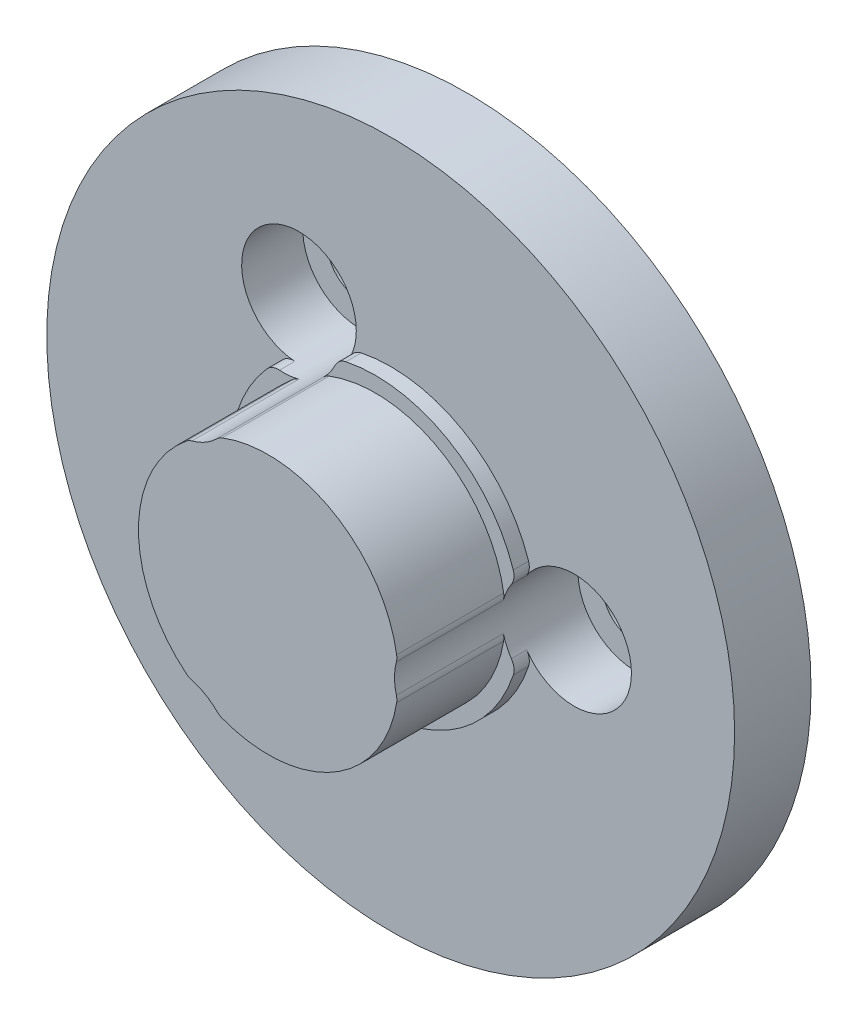
ISO-10303-21;
HEADER;
FILE_DESCRIPTION(('STEP AP214'),'2;1');
FILE_NAME('part.step','',(''),(''),'','','');
FILE_SCHEMA(('AUTOMOTIVE_DESIGN { 1 0 10303 214 1 1 1 1 }'));
ENDSEC;
DATA;
#1=APPLICATION_CONTEXT('core data for automotive mechanical design processes');
#2=APPLICATION_PROTOCOL_DEFINITION('international standard','automotive_design',2000,#1);
#3=PRODUCT_CONTEXT('',#1,'mechanical');
#4=PRODUCT('Part','Part','',(#3));
#5=PRODUCT_RELATED_PRODUCT_CATEGORY('part','',(#4));
#6=PRODUCT_DEFINITION_FORMATION('','',#4);
#7=PRODUCT_DEFINITION_CONTEXT('part definition',#1,'design');
#8=PRODUCT_DEFINITION('design','',#6,#7);
#9=PRODUCT_DEFINITION_SHAPE('','',#8);
#10=(LENGTH_UNIT() NAMED_UNIT(*) SI_UNIT(.MILLI.,.METRE.));
#11=(NAMED_UNIT(*) PLANE_ANGLE_UNIT() SI_UNIT($,.RADIAN.));
#12=(NAMED_UNIT(*) SI_UNIT($,.STERADIAN.) SOLID_ANGLE_UNIT());
#13=UNCERTAINTY_MEASURE_WITH_UNIT(LENGTH_MEASURE(1.E-05),#10,'distance_accuracy_value','');
#14=(GEOMETRIC_REPRESENTATION_CONTEXT(3) GLOBAL_UNCERTAINTY_ASSIGNED_CONTEXT((#13)) GLOBAL_UNIT_ASSIGNED_CONTEXT((#10,
#11,#12)) REPRESENTATION_CONTEXT('',''));
#15=CARTESIAN_POINT('',(0.,0.,0.));
#16=DIRECTION('',(0.,0.,1.));
#17=DIRECTION('',(1.,0.,0.));
#18=AXIS2_PLACEMENT_3D('',#15,#16,#17);
#19=CARTESIAN_POINT('',(0.,0.,37.));
#20=DIRECTION('',(0.,0.,1.));
#21=DIRECTION('',(1.,0.,0.));
#22=AXIS2_PLACEMENT_3D('',#19,#20,#21);
#23=PLANE('',#22);
#24=CARTESIAN_POINT('',(0.,0.,37.));
#25=DIRECTION('',(0.,0.,1.));
#26=DIRECTION('',(1.,0.,0.));
#27=AXIS2_PLACEMENT_3D('',#24,#25,#26);
#28=CIRCLE('',#27,9.5);
#29=CARTESIAN_POINT('',(-1.92716232852517,-9.30247522756785,37.));
#30=VERTEX_POINT('',#29);
#31=CARTESIAN_POINT('',(9.01976102941176,-2.98226608006476,37.));
#32=VERTEX_POINT('',#31);
#33=EDGE_CURVE('E261',#30,#32,#28,.T.);
#34=ORIENTED_EDGE('',*,*,#33,.T.);
#35=CARTESIAN_POINT('',(8.0703125,-2.66834333479479,37.));
#36=DIRECTION('',(0.,0.,1.));
#37=DIRECTION('',(1.,0.,0.));
#38=AXIS2_PLACEMENT_3D('',#35,#36,#37);
#39=CIRCLE('',#38,1.);
#40=CARTESIAN_POINT('',(8.89761513157895,-2.10658684325904,37.));
#41=VERTEX_POINT('',#40);
#42=EDGE_CURVE('E285',#32,#41,#39,.T.);
#43=ORIENTED_EDGE('',*,*,#42,.T.);
#44=CARTESIAN_POINT('',(12.,0.,37.));
#45=DIRECTION('',(0.,0.,1.));
#46=DIRECTION('',(1.,0.,0.));
#47=AXIS2_PLACEMENT_3D('',#44,#45,#46);
#48=CIRCLE('',#47,3.75);
#49=CARTESIAN_POINT('',(8.37129934210425,-0.946061063244322,37.));
#50=VERTEX_POINT('',#49);
#51=EDGE_CURVE('E249',#41,#50,#48,.F.);
#52=ORIENTED_EDGE('',*,*,#51,.T.);
#53=CARTESIAN_POINT('',(7.40364583333205,-1.19834401344281,37.));
#54=DIRECTION('',(0.,0.,1.));
#55=DIRECTION('',(1.,0.,0.));
#56=AXIS2_PLACEMENT_3D('',#53,#54,#55);
#57=CIRCLE('',#56,1.);
#58=CARTESIAN_POINT('',(8.39079861110993,-1.35812321523523,37.));
#59=VERTEX_POINT('',#58);
#60=EDGE_CURVE('E49',#50,#59,#57,.F.);
#61=ORIENTED_EDGE('',*,*,#60,.T.);
#62=CARTESIAN_POINT('',(0.,0.,37.));
#63=DIRECTION('',(0.,0.,1.));
#64=DIRECTION('',(1.,0.,0.));
#65=AXIS2_PLACEMENT_3D('',#62,#63,#64);
#66=CIRCLE('',#65,8.49999999999795);
#67=CARTESIAN_POINT('',(-3.01923009969186,-7.945706362878,37.));
#68=VERTEX_POINT('',#67);
#69=EDGE_CURVE('E362',#68,#59,#66,.T.);
#70=ORIENTED_EDGE('',*,*,#69,.F.);
#71=CARTESIAN_POINT('',(-2.66402655855156,-7.01091737900977,37.));
#72=DIRECTION('',(0.,0.,1.));
#73=DIRECTION('',(1.,0.,0.));
#74=AXIS2_PLACEMENT_3D('',#71,#72,#73);
#75=CIRCLE('',#74,1.);
#76=CARTESIAN_POINT('',(-3.36633675675123,-7.7227884245684,37.));
#77=VERTEX_POINT('',#76);
#78=EDGE_CURVE('E276',#68,#77,#75,.F.);
#79=ORIENTED_EDGE('',*,*,#78,.T.);
#80=CARTESIAN_POINT('',(-6.,-10.3923048454133,37.));
#81=DIRECTION('',(0.,0.,1.));
#82=DIRECTION('',(1.,0.,0.));
#83=AXIS2_PLACEMENT_3D('',#80,#81,#82);
#84=CIRCLE('',#83,3.75);
#85=CARTESIAN_POINT('',(-2.62444984424908,-8.75885415867371,37.));
#86=VERTEX_POINT('',#85);
#87=EDGE_CURVE('E259',#77,#86,#84,.F.);
#88=ORIENTED_EDGE('',*,*,#87,.T.);
#89=CARTESIAN_POINT('',(-1.72430313604883,-8.32326730887649,37.));
#90=DIRECTION('',(0.,0.,1.));
#91=DIRECTION('',(1.,0.,0.));
#92=AXIS2_PLACEMENT_3D('',#89,#90,#91);
#93=CIRCLE('',#92,1.);
#94=EDGE_CURVE('E273',#86,#30,#93,.T.);
#95=ORIENTED_EDGE('',*,*,#94,.T.);
#96=EDGE_LOOP('',(#34,#43,#52,#61,#70,#79,#88,#95));
#97=FACE_BOUND('',#96,.T.);
#98=ADVANCED_FACE('F41',(#97),#23,.T.);
#99=CARTESIAN_POINT('',(-7.0925987008866,6.32020914750309,37.));
#100=VERTEX_POINT('',#99);
#101=CARTESIAN_POINT('',(-7.0925987008866,-6.32020914750309,37.));
#102=VERTEX_POINT('',#101);
#103=EDGE_CURVE('E256',#100,#102,#28,.T.);
#104=ORIENTED_EDGE('',*,*,#103,.T.);
#105=CARTESIAN_POINT('',(-6.34600936395117,-5.65492397408171,37.));
#106=DIRECTION('',(0.,0.,1.));
#107=DIRECTION('',(1.,0.,0.));
#108=AXIS2_PLACEMENT_3D('',#105,#106,#107);
#109=CIRCLE('',#108,1.);
#110=CARTESIAN_POINT('',(-6.27316528732987,-6.65226731541467,37.));
#111=VERTEX_POINT('',#110);
#112=EDGE_CURVE('E308',#102,#111,#109,.T.);
#113=ORIENTED_EDGE('',*,*,#112,.T.);
#114=CARTESIAN_POINT('',(-5.00496258535302,-6.77672736132408,37.));
#115=VERTEX_POINT('',#114);
#116=EDGE_CURVE('E263',#111,#115,#84,.F.);
#117=ORIENTED_EDGE('',*,*,#116,.T.);
#118=CARTESIAN_POINT('',(-4.73961927478049,-5.81257336556697,37.));
#119=DIRECTION('',(0.,0.,1.));
#120=DIRECTION('',(1.,0.,0.));
#121=AXIS2_PLACEMENT_3D('',#118,#119,#120);
#122=CIRCLE('',#121,1.);
#123=CARTESIAN_POINT('',(-5.37156851141806,-6.58758314764278,37.));
#124=VERTEX_POINT('',#123);
#125=EDGE_CURVE('E359',#115,#124,#122,.F.);
#126=ORIENTED_EDGE('',*,*,#125,.T.);
#127=CARTESIAN_POINT('',(-5.37156851141807,6.58758314764277,37.));
#128=VERTEX_POINT('',#127);
#129=EDGE_CURVE('E254',#128,#124,#66,.T.);
#130=ORIENTED_EDGE('',*,*,#129,.F.);
#131=CARTESIAN_POINT('',(-4.7396192747805,5.81257336556696,37.));
#132=DIRECTION('',(0.,0.,1.));
#133=DIRECTION('',(1.,0.,0.));
#134=AXIS2_PLACEMENT_3D('',#131,#132,#133);
#135=CIRCLE('',#134,1.);
#136=CARTESIAN_POINT('',(-5.00496258535303,6.77672736132408,37.));
#137=VERTEX_POINT('',#136);
#138=EDGE_CURVE('E354',#128,#137,#135,.F.);
#139=ORIENTED_EDGE('',*,*,#138,.T.);
#140=CARTESIAN_POINT('',(-6.00000000000001,10.3923048454133,37.));
#141=DIRECTION('',(0.,0.,1.));
#142=DIRECTION('',(1.,0.,0.));
#143=AXIS2_PLACEMENT_3D('',#140,#141,#142);
#144=CIRCLE('',#143,3.75);
#145=CARTESIAN_POINT('',(-6.27316528732987,6.65226731541467,37.));
#146=VERTEX_POINT('',#145);
#147=EDGE_CURVE('E262',#137,#146,#144,.F.);
#148=ORIENTED_EDGE('',*,*,#147,.T.);
#149=CARTESIAN_POINT('',(-6.34600936395117,5.65492397408171,37.));
#150=DIRECTION('',(0.,0.,1.));
#151=DIRECTION('',(1.,0.,0.));
#152=AXIS2_PLACEMENT_3D('',#149,#150,#151);
#153=CIRCLE('',#152,1.);
#154=EDGE_CURVE('E306',#146,#100,#153,.T.);
#155=ORIENTED_EDGE('',*,*,#154,.T.);
#156=EDGE_LOOP('',(#104,#113,#117,#126,#130,#139,#148,#155));
#157=FACE_BOUND('',#156,.T.);
#158=ADVANCED_FACE('F410',(#157),#23,.T.);
#159=CARTESIAN_POINT('',(-6.00000000000001,10.3923048454133,36.));
#160=DIRECTION('',(0.,0.,-1.));
#161=DIRECTION('',(-1.,0.,0.));
#162=AXIS2_PLACEMENT_3D('',#159,#160,#161);
#163=CYLINDRICAL_SURFACE('',#162,2.15);
#164=CARTESIAN_POINT('',(-6.00000000000001,10.3923048454133,31.));
#165=DIRECTION('',(0.,0.,1.));
#166=DIRECTION('',(1.,0.,0.));
#167=AXIS2_PLACEMENT_3D('',#164,#165,#166);
#168=CIRCLE('',#167,2.15);
#169=CARTESIAN_POINT('',(-3.85000000000001,10.3923048454133,31.));
#170=VERTEX_POINT('',#169);
#171=EDGE_CURVE('E569',#170,#170,#168,.T.);
#172=ORIENTED_EDGE('',*,*,#171,.F.);
#173=EDGE_LOOP('',(#172));
#174=FACE_BOUND('',#173,.T.);
#175=CARTESIAN_POINT('',(-6.00000000000001,10.3923048454133,32.));
#176=DIRECTION('',(0.,0.,1.));
#177=DIRECTION('',(1.,0.,0.));
#178=AXIS2_PLACEMENT_3D('',#175,#176,#177);
#179=CIRCLE('',#178,2.15);
#180=CARTESIAN_POINT('',(-3.85000000000001,10.3923048454133,32.));
#181=VERTEX_POINT('',#180);
#182=EDGE_CURVE('E536',#181,#181,#179,.T.);
#183=ORIENTED_EDGE('',*,*,#182,.T.);
#184=EDGE_LOOP('',(#183));
#185=FACE_BOUND('',#184,.T.);
#186=ADVANCED_FACE('F417',(#174,#185),#163,.F.);
#187=CARTESIAN_POINT('',(-6.,-10.3923048454133,36.));
#188=DIRECTION('',(0.,0.,-1.));
#189=DIRECTION('',(-1.,0.,0.));
#190=AXIS2_PLACEMENT_3D('',#187,#188,#189);
#191=CYLINDRICAL_SURFACE('',#190,2.15);
#192=CARTESIAN_POINT('',(-6.,-10.3923048454133,31.));
#193=DIRECTION('',(0.,0.,1.));
#194=DIRECTION('',(1.,0.,0.));
#195=AXIS2_PLACEMENT_3D('',#192,#193,#194);
#196=CIRCLE('',#195,2.15);
#197=CARTESIAN_POINT('',(-3.85,-10.3923048454133,31.));
#198=VERTEX_POINT('',#197);
#199=EDGE_CURVE('E566',#198,#198,#196,.T.);
#200=ORIENTED_EDGE('',*,*,#199,.F.);
#201=EDGE_LOOP('',(#200));
#202=FACE_BOUND('',#201,.T.);
#203=CARTESIAN_POINT('',(-6.,-10.3923048454133,32.));
#204=DIRECTION('',(0.,0.,1.));
#205=DIRECTION('',(1.,0.,0.));
#206=AXIS2_PLACEMENT_3D('',#203,#204,#205);
#207=CIRCLE('',#206,2.15);
#208=CARTESIAN_POINT('',(-3.85,-10.3923048454133,32.));
#209=VERTEX_POINT('',#208);
#210=EDGE_CURVE('E576',#209,#209,#207,.T.);
#211=ORIENTED_EDGE('',*,*,#210,.T.);
#212=EDGE_LOOP('',(#211));
#213=FACE_BOUND('',#212,.T.);
#214=ADVANCED_FACE('F467',(#202,#213),#191,.F.);
#215=CARTESIAN_POINT('',(12.,0.,36.));
#216=DIRECTION('',(0.,0.,-1.));
#217=DIRECTION('',(-1.,0.,0.));
#218=AXIS2_PLACEMENT_3D('',#215,#216,#217);
#219=CYLINDRICAL_SURFACE('',#218,2.15);
#220=CARTESIAN_POINT('',(12.,0.,31.));
#221=DIRECTION('',(0.,0.,1.));
#222=DIRECTION('',(1.,0.,0.));
#223=AXIS2_PLACEMENT_3D('',#220,#221,#222);
#224=CIRCLE('',#223,2.15);
#225=CARTESIAN_POINT('',(14.15,0.,31.));
#226=VERTEX_POINT('',#225);
#227=EDGE_CURVE('E563',#226,#226,#224,.T.);
#228=ORIENTED_EDGE('',*,*,#227,.F.);
#229=EDGE_LOOP('',(#228));
#230=FACE_BOUND('',#229,.T.);
#231=CARTESIAN_POINT('',(12.,0.,32.));
#232=DIRECTION('',(0.,0.,1.));
#233=DIRECTION('',(1.,0.,0.));
#234=AXIS2_PLACEMENT_3D('',#231,#232,#233);
#235=CIRCLE('',#234,2.15);
#236=CARTESIAN_POINT('',(14.15,0.,32.));
#237=VERTEX_POINT('',#236);
#238=EDGE_CURVE('E574',#237,#237,#235,.T.);
#239=ORIENTED_EDGE('',*,*,#238,.T.);
#240=EDGE_LOOP('',(#239));
#241=FACE_BOUND('',#240,.T.);
#242=ADVANCED_FACE('F464',(#230,#241),#219,.F.);
#243=CARTESIAN_POINT('',(0.,0.,36.));
#244=DIRECTION('',(0.,0.,1.));
#245=DIRECTION('',(1.,0.,0.));
#246=AXIS2_PLACEMENT_3D('',#243,#244,#245);
#247=PLANE('',#246);
#248=CARTESIAN_POINT('',(0.,0.,36.));
#249=DIRECTION('',(0.,0.,1.));
#250=DIRECTION('',(1.,0.,0.));
#251=AXIS2_PLACEMENT_3D('',#248,#249,#250);
#252=CIRCLE('',#251,9.5);
#253=CARTESIAN_POINT('',(-1.92716232852517,-9.30247522756785,36.));
#254=VERTEX_POINT('',#253);
#255=CARTESIAN_POINT('',(9.01976102941176,-2.98226608006476,36.));
#256=VERTEX_POINT('',#255);
#257=EDGE_CURVE('E235',#254,#256,#252,.T.);
#258=ORIENTED_EDGE('',*,*,#257,.F.);
#259=CARTESIAN_POINT('',(-1.72430313604883,-8.32326730887649,36.));
#260=DIRECTION('',(0.,0.,1.));
#261=DIRECTION('',(1.,0.,0.));
#262=AXIS2_PLACEMENT_3D('',#259,#260,#261);
#263=CIRCLE('',#262,1.);
#264=CARTESIAN_POINT('',(-2.62444984424908,-8.75885415867371,36.));
#265=VERTEX_POINT('',#264);
#266=EDGE_CURVE('E347',#254,#265,#263,.F.);
#267=ORIENTED_EDGE('',*,*,#266,.T.);
#268=CARTESIAN_POINT('',(-6.,-10.3923048454133,36.));
#269=DIRECTION('',(0.,0.,1.));
#270=DIRECTION('',(1.,0.,0.));
#271=AXIS2_PLACEMENT_3D('',#268,#269,#270);
#272=CIRCLE('',#271,3.75);
#273=CARTESIAN_POINT('',(-6.27316528732987,-6.65226731541467,36.));
#274=VERTEX_POINT('',#273);
#275=EDGE_CURVE('E557',#274,#265,#272,.T.);
#276=ORIENTED_EDGE('',*,*,#275,.F.);
#277=CARTESIAN_POINT('',(-6.34600936395117,-5.65492397408171,36.));
#278=DIRECTION('',(0.,0.,1.));
#279=DIRECTION('',(1.,0.,0.));
#280=AXIS2_PLACEMENT_3D('',#277,#278,#279);
#281=CIRCLE('',#280,1.);
#282=CARTESIAN_POINT('',(-7.0925987008866,-6.32020914750309,36.));
#283=VERTEX_POINT('',#282);
#284=EDGE_CURVE('E345',#274,#283,#281,.F.);
#285=ORIENTED_EDGE('',*,*,#284,.T.);
#286=CARTESIAN_POINT('',(-7.0925987008866,6.32020914750309,36.));
#287=VERTEX_POINT('',#286);
#288=EDGE_CURVE('E232',#287,#283,#252,.T.);
#289=ORIENTED_EDGE('',*,*,#288,.F.);
#290=CARTESIAN_POINT('',(-6.34600936395117,5.65492397408171,36.));
#291=DIRECTION('',(0.,0.,1.));
#292=DIRECTION('',(1.,0.,0.));
#293=AXIS2_PLACEMENT_3D('',#290,#291,#292);
#294=CIRCLE('',#293,1.);
#295=CARTESIAN_POINT('',(-6.27316528732987,6.65226731541467,36.));
#296=VERTEX_POINT('',#295);
#297=EDGE_CURVE('E350',#287,#296,#294,.F.);
#298=ORIENTED_EDGE('',*,*,#297,.T.);
#299=CARTESIAN_POINT('',(-6.00000000000001,10.3923048454133,36.));
#300=DIRECTION('',(0.,0.,1.));
#301=DIRECTION('',(1.,0.,0.));
#302=AXIS2_PLACEMENT_3D('',#299,#300,#301);
#303=CIRCLE('',#302,3.75);
#304=CARTESIAN_POINT('',(-2.62444984424908,8.75885415867371,36.));
#305=VERTEX_POINT('',#304);
#306=EDGE_CURVE('E551',#305,#296,#303,.T.);
#307=ORIENTED_EDGE('',*,*,#306,.F.);
#308=CARTESIAN_POINT('',(-1.72430313604884,8.32326730887649,36.));
#309=DIRECTION('',(0.,0.,1.));
#310=DIRECTION('',(1.,0.,0.));
#311=AXIS2_PLACEMENT_3D('',#308,#309,#310);
#312=CIRCLE('',#311,1.);
#313=CARTESIAN_POINT('',(-1.92716232852517,9.30247522756785,36.));
#314=VERTEX_POINT('',#313);
#315=EDGE_CURVE('E231',#305,#314,#312,.F.);
#316=ORIENTED_EDGE('',*,*,#315,.T.);
#317=CARTESIAN_POINT('',(9.01976102941177,2.98226608006475,36.));
#318=VERTEX_POINT('',#317);
#319=EDGE_CURVE('E220',#318,#314,#252,.T.);
#320=ORIENTED_EDGE('',*,*,#319,.F.);
#321=CARTESIAN_POINT('',(8.0703125,2.66834333479478,36.));
#322=DIRECTION('',(0.,0.,1.));
#323=DIRECTION('',(1.,0.,0.));
#324=AXIS2_PLACEMENT_3D('',#321,#322,#323);
#325=CIRCLE('',#324,1.);
#326=CARTESIAN_POINT('',(8.89761513157895,2.10658684325904,36.));
#327=VERTEX_POINT('',#326);
#328=EDGE_CURVE('E205',#318,#327,#325,.F.);
#329=ORIENTED_EDGE('',*,*,#328,.T.);
#330=CARTESIAN_POINT('',(12.,0.,36.));
#331=DIRECTION('',(0.,0.,1.));
#332=DIRECTION('',(1.,0.,0.));
#333=AXIS2_PLACEMENT_3D('',#330,#331,#332);
#334=CIRCLE('',#333,3.75);
#335=CARTESIAN_POINT('',(8.89761513157895,-2.10658684325904,36.));
#336=VERTEX_POINT('',#335);
#337=EDGE_CURVE('E548',#336,#327,#334,.T.);
#338=ORIENTED_EDGE('',*,*,#337,.F.);
#339=CARTESIAN_POINT('',(8.0703125,-2.66834333479479,36.));
#340=DIRECTION('',(0.,0.,1.));
#341=DIRECTION('',(1.,0.,0.));
#342=AXIS2_PLACEMENT_3D('',#339,#340,#341);
#343=CIRCLE('',#342,1.);
#344=EDGE_CURVE('E213',#336,#256,#343,.F.);
#345=ORIENTED_EDGE('',*,*,#344,.T.);
#346=EDGE_LOOP('',(#258,#267,#276,#285,#289,#298,#307,#316,#320,#329,#338,#345));
#347=FACE_BOUND('',#346,.T.);
#348=CARTESIAN_POINT('',(0.,0.,36.));
#349=DIRECTION('',(0.,0.,1.));
#350=DIRECTION('',(1.,0.,0.));
#351=AXIS2_PLACEMENT_3D('',#348,#349,#350);
#352=CIRCLE('',#351,22.5);
#353=CARTESIAN_POINT('',(22.5,0.,36.));
#354=VERTEX_POINT('',#353);
#355=EDGE_CURVE('E530',#354,#354,#352,.T.);
#356=ORIENTED_EDGE('',*,*,#355,.T.);
#357=EDGE_LOOP('',(#356));
#358=FACE_BOUND('',#357,.T.);
#359=ADVANCED_FACE('F228',(#347,#358),#247,.T.);
#360=CARTESIAN_POINT('',(0.,0.,31.));
#361=DIRECTION('',(0.,0.,1.));
#362=DIRECTION('',(1.,0.,0.));
#363=AXIS2_PLACEMENT_3D('',#360,#361,#362);
#364=PLANE('',#363);
#365=CARTESIAN_POINT('',(0.,0.,31.));
#366=DIRECTION('',(0.,0.,1.));
#367=DIRECTION('',(1.,0.,0.));
#368=AXIS2_PLACEMENT_3D('',#365,#366,#367);
#369=CIRCLE('',#368,22.5);
#370=CARTESIAN_POINT('',(22.5,0.,31.));
#371=VERTEX_POINT('',#370);
#372=EDGE_CURVE('E533',#371,#371,#369,.T.);
#373=ORIENTED_EDGE('',*,*,#372,.F.);
#374=EDGE_LOOP('',(#373));
#375=FACE_BOUND('',#374,.T.);
#376=ORIENTED_EDGE('',*,*,#171,.T.);
#377=EDGE_LOOP('',(#376));
#378=FACE_BOUND('',#377,.T.);
#379=ORIENTED_EDGE('',*,*,#199,.T.);
#380=EDGE_LOOP('',(#379));
#381=FACE_BOUND('',#380,.T.);
#382=ORIENTED_EDGE('',*,*,#227,.T.);
#383=EDGE_LOOP('',(#382));
#384=FACE_BOUND('',#383,.T.);
#385=ADVANCED_FACE('F477',(#375,#378,#381,#384),#364,.F.);
#386=CARTESIAN_POINT('',(0.,0.,36.));
#387=DIRECTION('',(0.,0.,-1.));
#388=DIRECTION('',(-1.,0.,0.));
#389=AXIS2_PLACEMENT_3D('',#386,#387,#388);
#390=CYLINDRICAL_SURFACE('',#389,22.5);
#391=ORIENTED_EDGE('',*,*,#355,.F.);
#392=EDGE_LOOP('',(#391));
#393=FACE_BOUND('',#392,.T.);
#394=ORIENTED_EDGE('',*,*,#372,.T.);
#395=EDGE_LOOP('',(#394));
#396=FACE_BOUND('',#395,.T.);
#397=ADVANCED_FACE('F454',(#393,#396),#390,.T.);
#398=CARTESIAN_POINT('',(12.,0.,32.));
#399=DIRECTION('',(0.,0.,1.));
#400=DIRECTION('',(1.,0.,0.));
#401=AXIS2_PLACEMENT_3D('',#398,#399,#400);
#402=CYLINDRICAL_SURFACE('',#401,3.75);
#403=CARTESIAN_POINT('',(12.,0.,32.));
#404=DIRECTION('',(0.,0.,1.));
#405=DIRECTION('',(1.,0.,0.));
#406=AXIS2_PLACEMENT_3D('',#403,#404,#405);
#407=CIRCLE('',#406,3.75);
#408=CARTESIAN_POINT('',(15.75,0.,32.));
#409=VERTEX_POINT('',#408);
#410=EDGE_CURVE('E552',#409,#409,#407,.T.);
#411=ORIENTED_EDGE('',*,*,#410,.F.);
#412=EDGE_LOOP('',(#411));
#413=FACE_BOUND('',#412,.T.);
#414=ORIENTED_EDGE('',*,*,#337,.T.);
#415=DIRECTION('',(0.,0.,1.));
#416=VECTOR('',#415,1.);
#417=CARTESIAN_POINT('',(8.89761513157895,2.10658684325904,32.));
#418=LINE('',#417,#416);
#419=CARTESIAN_POINT('',(8.89761513157895,2.10658684325904,37.));
#420=VERTEX_POINT('',#419);
#421=EDGE_CURVE('E210',#327,#420,#418,.T.);
#422=ORIENTED_EDGE('',*,*,#421,.T.);
#423=CARTESIAN_POINT('',(8.37129934210425,0.94606106324432,37.));
#424=VERTEX_POINT('',#423);
#425=EDGE_CURVE('E244',#424,#420,#48,.F.);
#426=ORIENTED_EDGE('',*,*,#425,.F.);
#427=DIRECTION('',(0.,0.,1.));
#428=VECTOR('',#427,1.);
#429=CARTESIAN_POINT('',(8.37129934210425,0.94606106324432,32.));
#430=LINE('',#429,#428);
#431=CARTESIAN_POINT('',(8.37129934210425,0.94606106324432,44.));
#432=VERTEX_POINT('',#431);
#433=EDGE_CURVE('E224',#424,#432,#430,.T.);
#434=ORIENTED_EDGE('',*,*,#433,.T.);
#435=CARTESIAN_POINT('',(12.,0.,44.));
#436=DIRECTION('',(0.,0.,1.));
#437=DIRECTION('',(1.,0.,0.));
#438=AXIS2_PLACEMENT_3D('',#435,#436,#437);
#439=CIRCLE('',#438,3.75);
#440=CARTESIAN_POINT('',(8.37129934210425,-0.946061063244322,44.));
#441=VERTEX_POINT('',#440);
#442=EDGE_CURVE('E369',#441,#432,#439,.F.);
#443=ORIENTED_EDGE('',*,*,#442,.F.);
#444=DIRECTION('',(0.,0.,1.));
#445=VECTOR('',#444,1.);
#446=CARTESIAN_POINT('',(8.37129934210425,-0.946061063244322,32.));
#447=LINE('',#446,#445);
#448=EDGE_CURVE('E373',#441,#50,#447,.F.);
#449=ORIENTED_EDGE('',*,*,#448,.T.);
#450=ORIENTED_EDGE('',*,*,#51,.F.);
#451=DIRECTION('',(0.,0.,1.));
#452=VECTOR('',#451,1.);
#453=CARTESIAN_POINT('',(8.89761513157895,-2.10658684325904,32.));
#454=LINE('',#453,#452);
#455=EDGE_CURVE('E541',#41,#336,#454,.F.);
#456=ORIENTED_EDGE('',*,*,#455,.T.);
#457=EDGE_LOOP('',(#414,#422,#426,#434,#443,#449,#450,#456));
#458=FACE_BOUND('',#457,.T.);
#459=ADVANCED_FACE('F380',(#413,#458),#402,.F.);
#460=CARTESIAN_POINT('',(12.,0.,32.));
#461=DIRECTION('',(0.,0.,1.));
#462=DIRECTION('',(1.,0.,0.));
#463=AXIS2_PLACEMENT_3D('',#460,#461,#462);
#464=PLANE('',#463);
#465=ORIENTED_EDGE('',*,*,#238,.F.);
#466=EDGE_LOOP('',(#465));
#467=FACE_BOUND('',#466,.T.);
#468=ORIENTED_EDGE('',*,*,#410,.T.);
#469=EDGE_LOOP('',(#468));
#470=FACE_BOUND('',#469,.T.);
#471=ADVANCED_FACE('F453',(#467,#470),#464,.T.);
#472=CARTESIAN_POINT('',(-6.,-10.3923048454133,32.));
#473=DIRECTION('',(0.,0.,1.));
#474=DIRECTION('',(1.,0.,0.));
#475=AXIS2_PLACEMENT_3D('',#472,#473,#474);
#476=CYLINDRICAL_SURFACE('',#475,3.75);
#477=CARTESIAN_POINT('',(-6.,-10.3923048454133,32.));
#478=DIRECTION('',(0.,0.,1.));
#479=DIRECTION('',(1.,0.,0.));
#480=AXIS2_PLACEMENT_3D('',#477,#478,#479);
#481=CIRCLE('',#480,3.75);
#482=CARTESIAN_POINT('',(-2.25,-10.3923048454133,32.));
#483=VERTEX_POINT('',#482);
#484=EDGE_CURVE('E268',#483,#483,#481,.T.);
#485=ORIENTED_EDGE('',*,*,#484,.F.);
#486=EDGE_LOOP('',(#485));
#487=FACE_BOUND('',#486,.T.);
#488=ORIENTED_EDGE('',*,*,#116,.F.);
#489=DIRECTION('',(0.,0.,1.));
#490=VECTOR('',#489,1.);
#491=CARTESIAN_POINT('',(-6.27316528732987,-6.65226731541467,32.));
#492=LINE('',#491,#490);
#493=EDGE_CURVE('E298',#111,#274,#492,.F.);
#494=ORIENTED_EDGE('',*,*,#493,.T.);
#495=ORIENTED_EDGE('',*,*,#275,.T.);
#496=DIRECTION('',(0.,0.,1.));
#497=VECTOR('',#496,1.);
#498=CARTESIAN_POINT('',(-2.62444984424908,-8.75885415867371,32.));
#499=LINE('',#498,#497);
#500=EDGE_CURVE('E283',#265,#86,#499,.T.);
#501=ORIENTED_EDGE('',*,*,#500,.T.);
#502=ORIENTED_EDGE('',*,*,#87,.F.);
#503=DIRECTION('',(0.,0.,1.));
#504=VECTOR('',#503,1.);
#505=CARTESIAN_POINT('',(-3.36633675675123,-7.7227884245684,32.));
#506=LINE('',#505,#504);
#507=CARTESIAN_POINT('',(-3.36633675675123,-7.7227884245684,44.));
#508=VERTEX_POINT('',#507);
#509=EDGE_CURVE('E288',#77,#508,#506,.T.);
#510=ORIENTED_EDGE('',*,*,#509,.T.);
#511=CARTESIAN_POINT('',(-6.,-10.3923048454133,44.));
#512=DIRECTION('',(0.,0.,1.));
#513=DIRECTION('',(1.,0.,0.));
#514=AXIS2_PLACEMENT_3D('',#511,#512,#513);
#515=CIRCLE('',#514,3.75);
#516=CARTESIAN_POINT('',(-5.00496258535302,-6.77672736132408,44.));
#517=VERTEX_POINT('',#516);
#518=EDGE_CURVE('E237',#517,#508,#515,.F.);
#519=ORIENTED_EDGE('',*,*,#518,.F.);
#520=DIRECTION('',(0.,0.,1.));
#521=VECTOR('',#520,1.);
#522=CARTESIAN_POINT('',(-5.00496258535302,-6.77672736132408,32.));
#523=LINE('',#522,#521);
#524=EDGE_CURVE('E294',#517,#115,#523,.F.);
#525=ORIENTED_EDGE('',*,*,#524,.T.);
#526=EDGE_LOOP('',(#488,#494,#495,#501,#502,#510,#519,#525));
#527=FACE_BOUND('',#526,.T.);
#528=ADVANCED_FACE('F397',(#487,#527),#476,.F.);
#529=CARTESIAN_POINT('',(-6.,-10.3923048454133,32.));
#530=DIRECTION('',(0.,0.,1.));
#531=DIRECTION('',(1.,0.,0.));
#532=AXIS2_PLACEMENT_3D('',#529,#530,#531);
#533=PLANE('',#532);
#534=ORIENTED_EDGE('',*,*,#210,.F.);
#535=EDGE_LOOP('',(#534));
#536=FACE_BOUND('',#535,.T.);
#537=ORIENTED_EDGE('',*,*,#484,.T.);
#538=EDGE_LOOP('',(#537));
#539=FACE_BOUND('',#538,.T.);
#540=ADVANCED_FACE('F445',(#536,#539),#533,.T.);
#541=CARTESIAN_POINT('',(-6.00000000000001,10.3923048454133,32.));
#542=DIRECTION('',(0.,0.,1.));
#543=DIRECTION('',(1.,0.,0.));
#544=AXIS2_PLACEMENT_3D('',#541,#542,#543);
#545=CYLINDRICAL_SURFACE('',#544,3.75);
#546=CARTESIAN_POINT('',(-6.00000000000001,10.3923048454133,32.));
#547=DIRECTION('',(0.,0.,1.));
#548=DIRECTION('',(1.,0.,0.));
#549=AXIS2_PLACEMENT_3D('',#546,#547,#548);
#550=CIRCLE('',#549,3.75);
#551=CARTESIAN_POINT('',(-2.25000000000001,10.3923048454133,32.));
#552=VERTEX_POINT('',#551);
#553=EDGE_CURVE('E554',#552,#552,#550,.T.);
#554=ORIENTED_EDGE('',*,*,#553,.F.);
#555=EDGE_LOOP('',(#554));
#556=FACE_BOUND('',#555,.T.);
#557=ORIENTED_EDGE('',*,*,#306,.T.);
#558=DIRECTION('',(0.,0.,1.));
#559=VECTOR('',#558,1.);
#560=CARTESIAN_POINT('',(-6.27316528732987,6.65226731541467,32.));
#561=LINE('',#560,#559);
#562=EDGE_CURVE('E318',#296,#146,#561,.T.);
#563=ORIENTED_EDGE('',*,*,#562,.T.);
#564=ORIENTED_EDGE('',*,*,#147,.F.);
#565=DIRECTION('',(0.,0.,1.));
#566=VECTOR('',#565,1.);
#567=CARTESIAN_POINT('',(-5.00496258535303,6.77672736132408,32.));
#568=LINE('',#567,#566);
#569=CARTESIAN_POINT('',(-5.00496258535303,6.77672736132408,44.));
#570=VERTEX_POINT('',#569);
#571=EDGE_CURVE('E313',#137,#570,#568,.T.);
#572=ORIENTED_EDGE('',*,*,#571,.T.);
#573=CARTESIAN_POINT('',(-6.00000000000001,10.3923048454133,44.));
#574=DIRECTION('',(0.,0.,1.));
#575=DIRECTION('',(1.,0.,0.));
#576=AXIS2_PLACEMENT_3D('',#573,#574,#575);
#577=CIRCLE('',#576,3.75);
#578=CARTESIAN_POINT('',(-3.36633675675124,7.7227884245684,44.));
#579=VERTEX_POINT('',#578);
#580=EDGE_CURVE('E384',#579,#570,#577,.F.);
#581=ORIENTED_EDGE('',*,*,#580,.F.);
#582=DIRECTION('',(0.,0.,1.));
#583=VECTOR('',#582,1.);
#584=CARTESIAN_POINT('',(-3.36633675675124,7.7227884245684,32.));
#585=LINE('',#584,#583);
#586=CARTESIAN_POINT('',(-3.36633675675124,7.7227884245684,37.));
#587=VERTEX_POINT('',#586);
#588=EDGE_CURVE('E310',#579,#587,#585,.F.);
#589=ORIENTED_EDGE('',*,*,#588,.T.);
#590=CARTESIAN_POINT('',(-2.62444984424908,8.75885415867371,37.));
#591=VERTEX_POINT('',#590);
#592=EDGE_CURVE('E260',#591,#587,#144,.F.);
#593=ORIENTED_EDGE('',*,*,#592,.F.);
#594=DIRECTION('',(0.,0.,1.));
#595=VECTOR('',#594,1.);
#596=CARTESIAN_POINT('',(-2.62444984424908,8.75885415867371,32.));
#597=LINE('',#596,#595);
#598=EDGE_CURVE('E315',#591,#305,#597,.F.);
#599=ORIENTED_EDGE('',*,*,#598,.T.);
#600=EDGE_LOOP('',(#557,#563,#564,#572,#581,#589,#593,#599));
#601=FACE_BOUND('',#600,.T.);
#602=ADVANCED_FACE('F440',(#556,#601),#545,.F.);
#603=CARTESIAN_POINT('',(-6.00000000000001,10.3923048454133,32.));
#604=DIRECTION('',(0.,0.,1.));
#605=DIRECTION('',(1.,0.,0.));
#606=AXIS2_PLACEMENT_3D('',#603,#604,#605);
#607=PLANE('',#606);
#608=ORIENTED_EDGE('',*,*,#182,.F.);
#609=EDGE_LOOP('',(#608));
#610=FACE_BOUND('',#609,.T.);
#611=ORIENTED_EDGE('',*,*,#553,.T.);
#612=EDGE_LOOP('',(#611));
#613=FACE_BOUND('',#612,.T.);
#614=ADVANCED_FACE('F436',(#610,#613),#607,.T.);
#615=CARTESIAN_POINT('',(0.,0.,37.));
#616=DIRECTION('',(0.,0.,-1.));
#617=DIRECTION('',(-1.,0.,0.));
#618=AXIS2_PLACEMENT_3D('',#615,#616,#617);
#619=CYLINDRICAL_SURFACE('',#618,9.5);
#620=CARTESIAN_POINT('',(9.01976102941177,2.98226608006475,37.));
#621=VERTEX_POINT('',#620);
#622=CARTESIAN_POINT('',(-1.92716232852517,9.30247522756785,37.));
#623=VERTEX_POINT('',#622);
#624=EDGE_CURVE('E223',#621,#623,#28,.T.);
#625=ORIENTED_EDGE('',*,*,#624,.F.);
#626=DIRECTION('',(0.,0.,-1.));
#627=VECTOR('',#626,1.);
#628=CARTESIAN_POINT('',(9.01976102941177,2.98226608006475,37.));
#629=LINE('',#628,#627);
#630=EDGE_CURVE('E209',#621,#318,#629,.T.);
#631=ORIENTED_EDGE('',*,*,#630,.T.);
#632=ORIENTED_EDGE('',*,*,#319,.T.);
#633=DIRECTION('',(0.,0.,-1.));
#634=VECTOR('',#633,1.);
#635=CARTESIAN_POINT('',(-1.92716232852517,9.30247522756785,37.));
#636=LINE('',#635,#634);
#637=EDGE_CURVE('E225',#314,#623,#636,.F.);
#638=ORIENTED_EDGE('',*,*,#637,.T.);
#639=EDGE_LOOP('',(#625,#631,#632,#638));
#640=FACE_BOUND('',#639,.T.);
#641=ADVANCED_FACE('F219',(#640),#619,.T.);
#642=ORIENTED_EDGE('',*,*,#288,.T.);
#643=DIRECTION('',(0.,0.,-1.));
#644=VECTOR('',#643,1.);
#645=CARTESIAN_POINT('',(-7.0925987008866,-6.32020914750309,37.));
#646=LINE('',#645,#644);
#647=EDGE_CURVE('E304',#283,#102,#646,.F.);
#648=ORIENTED_EDGE('',*,*,#647,.T.);
#649=ORIENTED_EDGE('',*,*,#103,.F.);
#650=DIRECTION('',(0.,0.,-1.));
#651=VECTOR('',#650,1.);
#652=CARTESIAN_POINT('',(-7.0925987008866,6.32020914750309,37.));
#653=LINE('',#652,#651);
#654=EDGE_CURVE('E301',#100,#287,#653,.T.);
#655=ORIENTED_EDGE('',*,*,#654,.T.);
#656=EDGE_LOOP('',(#642,#648,#649,#655));
#657=FACE_BOUND('',#656,.T.);
#658=ADVANCED_FACE('F429',(#657),#619,.T.);
#659=ORIENTED_EDGE('',*,*,#257,.T.);
#660=DIRECTION('',(0.,0.,-1.));
#661=VECTOR('',#660,1.);
#662=CARTESIAN_POINT('',(9.01976102941177,-2.98226608006476,37.));
#663=LINE('',#662,#661);
#664=EDGE_CURVE('E286',#256,#32,#663,.F.);
#665=ORIENTED_EDGE('',*,*,#664,.T.);
#666=ORIENTED_EDGE('',*,*,#33,.F.);
#667=DIRECTION('',(0.,0.,-1.));
#668=VECTOR('',#667,1.);
#669=CARTESIAN_POINT('',(-1.92716232852517,-9.30247522756785,37.));
#670=LINE('',#669,#668);
#671=EDGE_CURVE('E284',#30,#254,#670,.T.);
#672=ORIENTED_EDGE('',*,*,#671,.T.);
#673=EDGE_LOOP('',(#659,#665,#666,#672));
#674=FACE_BOUND('',#673,.T.);
#675=ADVANCED_FACE('F422',(#674),#619,.T.);
#676=ORIENTED_EDGE('',*,*,#425,.T.);
#677=CARTESIAN_POINT('',(8.0703125,2.66834333479478,37.));
#678=DIRECTION('',(0.,0.,1.));
#679=DIRECTION('',(1.,0.,0.));
#680=AXIS2_PLACEMENT_3D('',#677,#678,#679);
#681=CIRCLE('',#680,1.);
#682=EDGE_CURVE('E546',#420,#621,#681,.T.);
#683=ORIENTED_EDGE('',*,*,#682,.T.);
#684=ORIENTED_EDGE('',*,*,#624,.T.);
#685=CARTESIAN_POINT('',(-1.72430313604884,8.32326730887649,37.));
#686=DIRECTION('',(0.,0.,1.));
#687=DIRECTION('',(1.,0.,0.));
#688=AXIS2_PLACEMENT_3D('',#685,#686,#687);
#689=CIRCLE('',#688,1.);
#690=EDGE_CURVE('E528',#623,#591,#689,.T.);
#691=ORIENTED_EDGE('',*,*,#690,.T.);
#692=ORIENTED_EDGE('',*,*,#592,.T.);
#693=CARTESIAN_POINT('',(-2.66402655855156,7.01091737900977,37.));
#694=DIRECTION('',(0.,0.,1.));
#695=DIRECTION('',(1.,0.,0.));
#696=AXIS2_PLACEMENT_3D('',#693,#694,#695);
#697=CIRCLE('',#696,1.);
#698=CARTESIAN_POINT('',(-3.01923009969187,7.94570636287799,37.));
#699=VERTEX_POINT('',#698);
#700=EDGE_CURVE('E357',#587,#699,#697,.F.);
#701=ORIENTED_EDGE('',*,*,#700,.T.);
#702=CARTESIAN_POINT('',(8.39079861110993,1.35812321523522,37.));
#703=VERTEX_POINT('',#702);
#704=EDGE_CURVE('E370',#703,#699,#66,.T.);
#705=ORIENTED_EDGE('',*,*,#704,.F.);
#706=CARTESIAN_POINT('',(7.40364583333205,1.1983440134428,37.));
#707=DIRECTION('',(0.,0.,1.));
#708=DIRECTION('',(1.,0.,0.));
#709=AXIS2_PLACEMENT_3D('',#706,#707,#708);
#710=CIRCLE('',#709,1.);
#711=EDGE_CURVE('E11',#703,#424,#710,.F.);
#712=ORIENTED_EDGE('',*,*,#711,.T.);
#713=EDGE_LOOP('',(#676,#683,#684,#691,#692,#701,#705,#712));
#714=FACE_BOUND('',#713,.T.);
#715=ADVANCED_FACE('F412',(#714),#23,.T.);
#716=CARTESIAN_POINT('',(0.,0.,44.));
#717=DIRECTION('',(0.,0.,-1.));
#718=DIRECTION('',(-1.,0.,0.));
#719=AXIS2_PLACEMENT_3D('',#716,#717,#718);
#720=CYLINDRICAL_SURFACE('',#719,8.49999999999795);
#721=ORIENTED_EDGE('',*,*,#704,.T.);
#722=DIRECTION('',(0.,0.,-1.));
#723=VECTOR('',#722,1.);
#724=CARTESIAN_POINT('',(-3.01923009969187,7.94570636287799,44.));
#725=LINE('',#724,#723);
#726=CARTESIAN_POINT('',(-3.01923009969187,7.94570636287799,44.));
#727=VERTEX_POINT('',#726);
#728=EDGE_CURVE('E339',#699,#727,#725,.F.);
#729=ORIENTED_EDGE('',*,*,#728,.T.);
#730=CARTESIAN_POINT('',(0.,0.,44.));
#731=DIRECTION('',(0.,0.,1.));
#732=DIRECTION('',(1.,0.,0.));
#733=AXIS2_PLACEMENT_3D('',#730,#731,#732);
#734=CIRCLE('',#733,8.49999999999795);
#735=CARTESIAN_POINT('',(8.39079861110993,1.35812321523522,44.));
#736=VERTEX_POINT('',#735);
#737=EDGE_CURVE('E239',#736,#727,#734,.T.);
#738=ORIENTED_EDGE('',*,*,#737,.F.);
#739=DIRECTION('',(0.,0.,-1.));
#740=VECTOR('',#739,1.);
#741=CARTESIAN_POINT('',(8.39079861110993,1.35812321523522,44.));
#742=LINE('',#741,#740);
#743=EDGE_CURVE('E336',#736,#703,#742,.T.);
#744=ORIENTED_EDGE('',*,*,#743,.T.);
#745=EDGE_LOOP('',(#721,#729,#738,#744));
#746=FACE_BOUND('',#745,.T.);
#747=ADVANCED_FACE('F421',(#746),#720,.T.);
#748=CARTESIAN_POINT('',(-5.37156851141807,6.58758314764277,44.));
#749=VERTEX_POINT('',#748);
#750=CARTESIAN_POINT('',(-5.37156851141806,-6.58758314764278,44.));
#751=VERTEX_POINT('',#750);
#752=EDGE_CURVE('E240',#749,#751,#734,.T.);
#753=ORIENTED_EDGE('',*,*,#752,.F.);
#754=DIRECTION('',(0.,0.,-1.));
#755=VECTOR('',#754,1.);
#756=CARTESIAN_POINT('',(-5.37156851141807,6.58758314764277,44.));
#757=LINE('',#756,#755);
#758=EDGE_CURVE('E322',#749,#128,#757,.T.);
#759=ORIENTED_EDGE('',*,*,#758,.T.);
#760=ORIENTED_EDGE('',*,*,#129,.T.);
#761=DIRECTION('',(0.,0.,-1.));
#762=VECTOR('',#761,1.);
#763=CARTESIAN_POINT('',(-5.37156851141807,-6.58758314764278,44.));
#764=LINE('',#763,#762);
#765=EDGE_CURVE('E320',#124,#751,#764,.F.);
#766=ORIENTED_EDGE('',*,*,#765,.T.);
#767=EDGE_LOOP('',(#753,#759,#760,#766));
#768=FACE_BOUND('',#767,.T.);
#769=ADVANCED_FACE('F427',(#768),#720,.T.);
#770=CARTESIAN_POINT('',(-3.01923009969186,-7.945706362878,44.));
#771=VERTEX_POINT('',#770);
#772=CARTESIAN_POINT('',(8.39079861110993,-1.35812321523523,44.));
#773=VERTEX_POINT('',#772);
#774=EDGE_CURVE('E233',#771,#773,#734,.T.);
#775=ORIENTED_EDGE('',*,*,#774,.F.);
#776=DIRECTION('',(0.,0.,-1.));
#777=VECTOR('',#776,1.);
#778=CARTESIAN_POINT('',(-3.01923009969186,-7.945706362878,44.));
#779=LINE('',#778,#777);
#780=EDGE_CURVE('E214',#771,#68,#779,.T.);
#781=ORIENTED_EDGE('',*,*,#780,.T.);
#782=ORIENTED_EDGE('',*,*,#69,.T.);
#783=DIRECTION('',(0.,0.,-1.));
#784=VECTOR('',#783,1.);
#785=CARTESIAN_POINT('',(8.39079861110993,-1.35812321523523,44.));
#786=LINE('',#785,#784);
#787=EDGE_CURVE('E56',#59,#773,#786,.F.);
#788=ORIENTED_EDGE('',*,*,#787,.T.);
#789=EDGE_LOOP('',(#775,#781,#782,#788));
#790=FACE_BOUND('',#789,.T.);
#791=ADVANCED_FACE('F367',(#790),#720,.T.);
#792=CARTESIAN_POINT('',(0.,0.,44.));
#793=DIRECTION('',(0.,0.,1.));
#794=DIRECTION('',(1.,0.,0.));
#795=AXIS2_PLACEMENT_3D('',#792,#793,#794);
#796=PLANE('',#795);
#797=ORIENTED_EDGE('',*,*,#580,.T.);
#798=CARTESIAN_POINT('',(-4.7396192747805,5.81257336556696,44.));
#799=DIRECTION('',(0.,0.,1.));
#800=DIRECTION('',(1.,0.,0.));
#801=AXIS2_PLACEMENT_3D('',#798,#799,#800);
#802=CIRCLE('',#801,1.);
#803=EDGE_CURVE('E334',#570,#749,#802,.T.);
#804=ORIENTED_EDGE('',*,*,#803,.T.);
#805=ORIENTED_EDGE('',*,*,#752,.T.);
#806=CARTESIAN_POINT('',(-4.73961927478049,-5.81257336556697,44.));
#807=DIRECTION('',(0.,0.,1.));
#808=DIRECTION('',(1.,0.,0.));
#809=AXIS2_PLACEMENT_3D('',#806,#807,#808);
#810=CIRCLE('',#809,1.);
#811=EDGE_CURVE('E330',#751,#517,#810,.T.);
#812=ORIENTED_EDGE('',*,*,#811,.T.);
#813=ORIENTED_EDGE('',*,*,#518,.T.);
#814=CARTESIAN_POINT('',(-2.66402655855156,-7.01091737900977,44.));
#815=DIRECTION('',(0.,0.,1.));
#816=DIRECTION('',(1.,0.,0.));
#817=AXIS2_PLACEMENT_3D('',#814,#815,#816);
#818=CIRCLE('',#817,1.);
#819=EDGE_CURVE('E63',#508,#771,#818,.T.);
#820=ORIENTED_EDGE('',*,*,#819,.T.);
#821=ORIENTED_EDGE('',*,*,#774,.T.);
#822=CARTESIAN_POINT('',(7.40364583333205,-1.19834401344281,44.));
#823=DIRECTION('',(0.,0.,1.));
#824=DIRECTION('',(1.,0.,0.));
#825=AXIS2_PLACEMENT_3D('',#822,#823,#824);
#826=CIRCLE('',#825,1.);
#827=EDGE_CURVE('E327',#773,#441,#826,.T.);
#828=ORIENTED_EDGE('',*,*,#827,.T.);
#829=ORIENTED_EDGE('',*,*,#442,.T.);
#830=CARTESIAN_POINT('',(7.40364583333205,1.1983440134428,44.));
#831=DIRECTION('',(0.,0.,1.));
#832=DIRECTION('',(1.,0.,0.));
#833=AXIS2_PLACEMENT_3D('',#830,#831,#832);
#834=CIRCLE('',#833,1.);
#835=EDGE_CURVE('E325',#432,#736,#834,.T.);
#836=ORIENTED_EDGE('',*,*,#835,.T.);
#837=ORIENTED_EDGE('',*,*,#737,.T.);
#838=CARTESIAN_POINT('',(-2.66402655855156,7.01091737900977,44.));
#839=DIRECTION('',(0.,0.,1.));
#840=DIRECTION('',(1.,0.,0.));
#841=AXIS2_PLACEMENT_3D('',#838,#839,#840);
#842=CIRCLE('',#841,1.);
#843=EDGE_CURVE('E332',#727,#579,#842,.T.);
#844=ORIENTED_EDGE('',*,*,#843,.T.);
#845=EDGE_LOOP('',(#797,#804,#805,#812,#813,#820,#821,#828,#829,#836,#837,#844));
#846=FACE_BOUND('',#845,.T.);
#847=ADVANCED_FACE('F377',(#846),#796,.T.);
#848=CARTESIAN_POINT('',(8.0703125,2.66834333479478,32.));
#849=DIRECTION('',(0.,0.,1.));
#850=DIRECTION('',(1.,0.,0.));
#851=AXIS2_PLACEMENT_3D('',#848,#849,#850);
#852=CYLINDRICAL_SURFACE('',#851,1.);
#853=ORIENTED_EDGE('',*,*,#682,.F.);
#854=ORIENTED_EDGE('',*,*,#421,.F.);
#855=ORIENTED_EDGE('',*,*,#328,.F.);
#856=ORIENTED_EDGE('',*,*,#630,.F.);
#857=EDGE_LOOP('',(#853,#854,#855,#856));
#858=FACE_BOUND('',#857,.T.);
#859=ADVANCED_FACE('F208',(#858),#852,.T.);
#860=CARTESIAN_POINT('',(8.0703125,-2.66834333479479,37.));
#861=DIRECTION('',(0.,0.,1.));
#862=DIRECTION('',(1.,0.,0.));
#863=AXIS2_PLACEMENT_3D('',#860,#861,#862);
#864=CYLINDRICAL_SURFACE('',#863,1.);
#865=ORIENTED_EDGE('',*,*,#42,.F.);
#866=ORIENTED_EDGE('',*,*,#664,.F.);
#867=ORIENTED_EDGE('',*,*,#344,.F.);
#868=ORIENTED_EDGE('',*,*,#455,.F.);
#869=EDGE_LOOP('',(#865,#866,#867,#868));
#870=FACE_BOUND('',#869,.T.);
#871=ADVANCED_FACE('F486',(#870),#864,.T.);
#872=CARTESIAN_POINT('',(-6.34600936395117,-5.65492397408171,37.));
#873=DIRECTION('',(0.,0.,1.));
#874=DIRECTION('',(1.,0.,0.));
#875=AXIS2_PLACEMENT_3D('',#872,#873,#874);
#876=CYLINDRICAL_SURFACE('',#875,1.);
#877=ORIENTED_EDGE('',*,*,#112,.F.);
#878=ORIENTED_EDGE('',*,*,#647,.F.);
#879=ORIENTED_EDGE('',*,*,#284,.F.);
#880=ORIENTED_EDGE('',*,*,#493,.F.);
#881=EDGE_LOOP('',(#877,#878,#879,#880));
#882=FACE_BOUND('',#881,.T.);
#883=ADVANCED_FACE('F489',(#882),#876,.T.);
#884=CARTESIAN_POINT('',(-1.72430313604883,-8.32326730887649,32.));
#885=DIRECTION('',(0.,0.,1.));
#886=DIRECTION('',(1.,0.,0.));
#887=AXIS2_PLACEMENT_3D('',#884,#885,#886);
#888=CYLINDRICAL_SURFACE('',#887,1.);
#889=ORIENTED_EDGE('',*,*,#94,.F.);
#890=ORIENTED_EDGE('',*,*,#500,.F.);
#891=ORIENTED_EDGE('',*,*,#266,.F.);
#892=ORIENTED_EDGE('',*,*,#671,.F.);
#893=EDGE_LOOP('',(#889,#890,#891,#892));
#894=FACE_BOUND('',#893,.T.);
#895=ADVANCED_FACE('F282',(#894),#888,.T.);
#896=CARTESIAN_POINT('',(-6.34600936395117,5.65492397408171,32.));
#897=DIRECTION('',(0.,0.,1.));
#898=DIRECTION('',(1.,0.,0.));
#899=AXIS2_PLACEMENT_3D('',#896,#897,#898);
#900=CYLINDRICAL_SURFACE('',#899,1.);
#901=ORIENTED_EDGE('',*,*,#154,.F.);
#902=ORIENTED_EDGE('',*,*,#562,.F.);
#903=ORIENTED_EDGE('',*,*,#297,.F.);
#904=ORIENTED_EDGE('',*,*,#654,.F.);
#905=EDGE_LOOP('',(#901,#902,#903,#904));
#906=FACE_BOUND('',#905,.T.);
#907=ADVANCED_FACE('F496',(#906),#900,.T.);
#908=CARTESIAN_POINT('',(-1.72430313604884,8.32326730887649,37.));
#909=DIRECTION('',(0.,0.,1.));
#910=DIRECTION('',(1.,0.,0.));
#911=AXIS2_PLACEMENT_3D('',#908,#909,#910);
#912=CYLINDRICAL_SURFACE('',#911,1.);
#913=ORIENTED_EDGE('',*,*,#690,.F.);
#914=ORIENTED_EDGE('',*,*,#637,.F.);
#915=ORIENTED_EDGE('',*,*,#315,.F.);
#916=ORIENTED_EDGE('',*,*,#598,.F.);
#917=EDGE_LOOP('',(#913,#914,#915,#916));
#918=FACE_BOUND('',#917,.T.);
#919=ADVANCED_FACE('F499',(#918),#912,.T.);
#920=CARTESIAN_POINT('',(-4.7396192747805,5.81257336556696,32.));
#921=DIRECTION('',(0.,0.,1.));
#922=DIRECTION('',(1.,0.,0.));
#923=AXIS2_PLACEMENT_3D('',#920,#921,#922);
#924=CYLINDRICAL_SURFACE('',#923,1.);
#925=ORIENTED_EDGE('',*,*,#803,.F.);
#926=ORIENTED_EDGE('',*,*,#571,.F.);
#927=ORIENTED_EDGE('',*,*,#138,.F.);
#928=ORIENTED_EDGE('',*,*,#758,.F.);
#929=EDGE_LOOP('',(#925,#926,#927,#928));
#930=FACE_BOUND('',#929,.T.);
#931=ADVANCED_FACE('F503',(#930),#924,.T.);
#932=CARTESIAN_POINT('',(-2.66402655855156,7.01091737900977,44.));
#933=DIRECTION('',(0.,0.,1.));
#934=DIRECTION('',(1.,0.,0.));
#935=AXIS2_PLACEMENT_3D('',#932,#933,#934);
#936=CYLINDRICAL_SURFACE('',#935,1.);
#937=ORIENTED_EDGE('',*,*,#843,.F.);
#938=ORIENTED_EDGE('',*,*,#728,.F.);
#939=ORIENTED_EDGE('',*,*,#700,.F.);
#940=ORIENTED_EDGE('',*,*,#588,.F.);
#941=EDGE_LOOP('',(#937,#938,#939,#940));
#942=FACE_BOUND('',#941,.T.);
#943=ADVANCED_FACE('F407',(#942),#936,.T.);
#944=CARTESIAN_POINT('',(-4.73961927478049,-5.81257336556697,44.));
#945=DIRECTION('',(0.,0.,1.));
#946=DIRECTION('',(1.,0.,0.));
#947=AXIS2_PLACEMENT_3D('',#944,#945,#946);
#948=CYLINDRICAL_SURFACE('',#947,1.);
#949=ORIENTED_EDGE('',*,*,#811,.F.);
#950=ORIENTED_EDGE('',*,*,#765,.F.);
#951=ORIENTED_EDGE('',*,*,#125,.F.);
#952=ORIENTED_EDGE('',*,*,#524,.F.);
#953=EDGE_LOOP('',(#949,#950,#951,#952));
#954=FACE_BOUND('',#953,.T.);
#955=ADVANCED_FACE('F396',(#954),#948,.T.);
#956=CARTESIAN_POINT('',(-2.66402655855156,-7.01091737900977,32.));
#957=DIRECTION('',(0.,0.,1.));
#958=DIRECTION('',(1.,0.,0.));
#959=AXIS2_PLACEMENT_3D('',#956,#957,#958);
#960=CYLINDRICAL_SURFACE('',#959,1.);
#961=ORIENTED_EDGE('',*,*,#819,.F.);
#962=ORIENTED_EDGE('',*,*,#509,.F.);
#963=ORIENTED_EDGE('',*,*,#78,.F.);
#964=ORIENTED_EDGE('',*,*,#780,.F.);
#965=EDGE_LOOP('',(#961,#962,#963,#964));
#966=FACE_BOUND('',#965,.T.);
#967=ADVANCED_FACE('F400',(#966),#960,.T.);
#968=CARTESIAN_POINT('',(7.40364583333205,-1.19834401344281,44.));
#969=DIRECTION('',(0.,0.,1.));
#970=DIRECTION('',(1.,0.,0.));
#971=AXIS2_PLACEMENT_3D('',#968,#969,#970);
#972=CYLINDRICAL_SURFACE('',#971,1.);
#973=ORIENTED_EDGE('',*,*,#827,.F.);
#974=ORIENTED_EDGE('',*,*,#787,.F.);
#975=ORIENTED_EDGE('',*,*,#60,.F.);
#976=ORIENTED_EDGE('',*,*,#448,.F.);
#977=EDGE_LOOP('',(#973,#974,#975,#976));
#978=FACE_BOUND('',#977,.T.);
#979=ADVANCED_FACE('F372',(#978),#972,.T.);
#980=CARTESIAN_POINT('',(7.40364583333205,1.1983440134428,32.));
#981=DIRECTION('',(0.,0.,1.));
#982=DIRECTION('',(1.,0.,0.));
#983=AXIS2_PLACEMENT_3D('',#980,#981,#982);
#984=CYLINDRICAL_SURFACE('',#983,1.);
#985=ORIENTED_EDGE('',*,*,#835,.F.);
#986=ORIENTED_EDGE('',*,*,#433,.F.);
#987=ORIENTED_EDGE('',*,*,#711,.F.);
#988=ORIENTED_EDGE('',*,*,#743,.F.);
#989=EDGE_LOOP('',(#985,#986,#987,#988));
#990=FACE_BOUND('',#989,.T.);
#991=ADVANCED_FACE('F43',(#990),#984,.T.);
#992=CLOSED_SHELL('',(#98,#158,#186,#214,#242,#359,#385,#397,#459,#471,#528,#540,#602,#614,#641,
#658,#675,#715,#747,#769,#791,#847,#859,#871,#883,#895,#907,#919,#931,#943,#955,#967,#979,#991));
#993=MANIFOLD_SOLID_BREP('B2',#992);
#994=ADVANCED_BREP_SHAPE_REPRESENTATION('',(#18,#993),#14);
#995=SHAPE_DEFINITION_REPRESENTATION(#9,#994);
ENDSEC;
END-ISO-10303-21;
